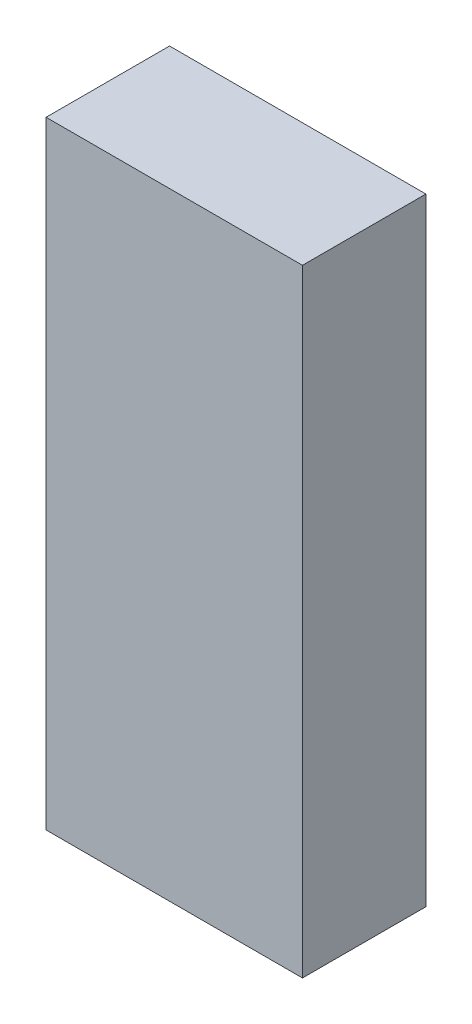
ISO-10303-21;
HEADER;
FILE_DESCRIPTION(('STEP AP214'),'2;1');
FILE_NAME('part.step','',(''),(''),'','','');
FILE_SCHEMA(('AUTOMOTIVE_DESIGN { 1 0 10303 214 1 1 1 1 }'));
ENDSEC;
DATA;
#1=APPLICATION_CONTEXT('core data for automotive mechanical design processes');
#2=APPLICATION_PROTOCOL_DEFINITION('international standard','automotive_design',2000,#1);
#3=PRODUCT_CONTEXT('',#1,'mechanical');
#4=PRODUCT('Part','Part','',(#3));
#5=PRODUCT_RELATED_PRODUCT_CATEGORY('part','',(#4));
#6=PRODUCT_DEFINITION_FORMATION('','',#4);
#7=PRODUCT_DEFINITION_CONTEXT('part definition',#1,'design');
#8=PRODUCT_DEFINITION('design','',#6,#7);
#9=PRODUCT_DEFINITION_SHAPE('','',#8);
#10=(LENGTH_UNIT() NAMED_UNIT(*) SI_UNIT(.MILLI.,.METRE.));
#11=(NAMED_UNIT(*) PLANE_ANGLE_UNIT() SI_UNIT($,.RADIAN.));
#12=(NAMED_UNIT(*) SI_UNIT($,.STERADIAN.) SOLID_ANGLE_UNIT());
#13=UNCERTAINTY_MEASURE_WITH_UNIT(LENGTH_MEASURE(1.E-05),#10,'distance_accuracy_value','');
#14=(GEOMETRIC_REPRESENTATION_CONTEXT(3) GLOBAL_UNCERTAINTY_ASSIGNED_CONTEXT((#13)) GLOBAL_UNIT_ASSIGNED_CONTEXT((#10,
#11,#12)) REPRESENTATION_CONTEXT('',''));
#15=CARTESIAN_POINT('',(0.,0.,0.));
#16=DIRECTION('',(0.,0.,1.));
#17=DIRECTION('',(1.,0.,0.));
#18=AXIS2_PLACEMENT_3D('',#15,#16,#17);
#19=CARTESIAN_POINT('',(13.5,-32.5,6.5));
#20=DIRECTION('',(-1.,0.,0.));
#21=DIRECTION('',(0.,0.,1.));
#22=AXIS2_PLACEMENT_3D('',#19,#20,#21);
#23=PLANE('',#22);
#24=DIRECTION('',(0.,1.,0.));
#25=VECTOR('',#24,1.);
#26=CARTESIAN_POINT('',(13.5,-32.5,-6.5));
#27=LINE('',#26,#25);
#28=CARTESIAN_POINT('',(13.5,-32.5,-6.5));
#29=VERTEX_POINT('',#28);
#30=CARTESIAN_POINT('',(13.5,32.5,-6.5));
#31=VERTEX_POINT('',#30);
#32=EDGE_CURVE('E104',#29,#31,#27,.T.);
#33=ORIENTED_EDGE('',*,*,#32,.T.);
#34=DIRECTION('',(0.,0.,-1.));
#35=VECTOR('',#34,1.);
#36=CARTESIAN_POINT('',(13.5,32.5,6.5));
#37=LINE('',#36,#35);
#38=CARTESIAN_POINT('',(13.5,32.5,6.5));
#39=VERTEX_POINT('',#38);
#40=EDGE_CURVE('E11',#39,#31,#37,.T.);
#41=ORIENTED_EDGE('',*,*,#40,.F.);
#42=DIRECTION('',(0.,1.,0.));
#43=VECTOR('',#42,1.);
#44=CARTESIAN_POINT('',(13.5,-32.5,6.5));
#45=LINE('',#44,#43);
#46=CARTESIAN_POINT('',(13.5,-32.5,6.5));
#47=VERTEX_POINT('',#46);
#48=EDGE_CURVE('E92',#47,#39,#45,.T.);
#49=ORIENTED_EDGE('',*,*,#48,.F.);
#50=DIRECTION('',(0.,0.,-1.));
#51=VECTOR('',#50,1.);
#52=CARTESIAN_POINT('',(13.5,-32.5,6.5));
#53=LINE('',#52,#51);
#54=EDGE_CURVE('E100',#47,#29,#53,.T.);
#55=ORIENTED_EDGE('',*,*,#54,.T.);
#56=EDGE_LOOP('',(#33,#41,#49,#55));
#57=FACE_BOUND('',#56,.T.);
#58=ADVANCED_FACE('F41',(#57),#23,.F.);
#59=CARTESIAN_POINT('',(-13.5,32.5,6.5));
#60=DIRECTION('',(0.,-1.,0.));
#61=DIRECTION('',(0.,0.,-1.));
#62=AXIS2_PLACEMENT_3D('',#59,#60,#61);
#63=PLANE('',#62);
#64=DIRECTION('',(-1.,0.,0.));
#65=VECTOR('',#64,1.);
#66=CARTESIAN_POINT('',(-13.5,32.5,-6.5));
#67=LINE('',#66,#65);
#68=CARTESIAN_POINT('',(-13.5,32.5,-6.5));
#69=VERTEX_POINT('',#68);
#70=EDGE_CURVE('E96',#31,#69,#67,.T.);
#71=ORIENTED_EDGE('',*,*,#70,.T.);
#72=DIRECTION('',(0.,0.,-1.));
#73=VECTOR('',#72,1.);
#74=CARTESIAN_POINT('',(-13.5,32.5,6.5));
#75=LINE('',#74,#73);
#76=CARTESIAN_POINT('',(-13.5,32.5,6.5));
#77=VERTEX_POINT('',#76);
#78=EDGE_CURVE('E49',#77,#69,#75,.T.);
#79=ORIENTED_EDGE('',*,*,#78,.F.);
#80=DIRECTION('',(-1.,0.,0.));
#81=VECTOR('',#80,1.);
#82=CARTESIAN_POINT('',(-13.5,32.5,6.5));
#83=LINE('',#82,#81);
#84=EDGE_CURVE('E87',#39,#77,#83,.T.);
#85=ORIENTED_EDGE('',*,*,#84,.F.);
#86=ORIENTED_EDGE('',*,*,#40,.T.);
#87=EDGE_LOOP('',(#71,#79,#85,#86));
#88=FACE_BOUND('',#87,.T.);
#89=ADVANCED_FACE('F95',(#88),#63,.F.);
#90=CARTESIAN_POINT('',(-13.5,-32.5,6.5));
#91=DIRECTION('',(1.,0.,0.));
#92=DIRECTION('',(0.,0.,-1.));
#93=AXIS2_PLACEMENT_3D('',#90,#91,#92);
#94=PLANE('',#93);
#95=DIRECTION('',(0.,-1.,0.));
#96=VECTOR('',#95,1.);
#97=CARTESIAN_POINT('',(-13.5,-32.5,-6.5));
#98=LINE('',#97,#96);
#99=CARTESIAN_POINT('',(-13.5,-32.5,-6.5));
#100=VERTEX_POINT('',#99);
#101=EDGE_CURVE('E74',#69,#100,#98,.T.);
#102=ORIENTED_EDGE('',*,*,#101,.T.);
#103=DIRECTION('',(0.,0.,-1.));
#104=VECTOR('',#103,1.);
#105=CARTESIAN_POINT('',(-13.5,-32.5,6.5));
#106=LINE('',#105,#104);
#107=CARTESIAN_POINT('',(-13.5,-32.5,6.5));
#108=VERTEX_POINT('',#107);
#109=EDGE_CURVE('E97',#108,#100,#106,.T.);
#110=ORIENTED_EDGE('',*,*,#109,.F.);
#111=DIRECTION('',(0.,-1.,0.));
#112=VECTOR('',#111,1.);
#113=CARTESIAN_POINT('',(-13.5,-32.5,6.5));
#114=LINE('',#113,#112);
#115=EDGE_CURVE('E90',#77,#108,#114,.T.);
#116=ORIENTED_EDGE('',*,*,#115,.F.);
#117=ORIENTED_EDGE('',*,*,#78,.T.);
#118=EDGE_LOOP('',(#102,#110,#116,#117));
#119=FACE_BOUND('',#118,.T.);
#120=ADVANCED_FACE('F98',(#119),#94,.F.);
#121=CARTESIAN_POINT('',(-13.5,-32.5,6.5));
#122=DIRECTION('',(0.,1.,0.));
#123=DIRECTION('',(0.,0.,1.));
#124=AXIS2_PLACEMENT_3D('',#121,#122,#123);
#125=PLANE('',#124);
#126=DIRECTION('',(1.,0.,0.));
#127=VECTOR('',#126,1.);
#128=CARTESIAN_POINT('',(-13.5,-32.5,-6.5));
#129=LINE('',#128,#127);
#130=EDGE_CURVE('E80',#100,#29,#129,.T.);
#131=ORIENTED_EDGE('',*,*,#130,.T.);
#132=ORIENTED_EDGE('',*,*,#54,.F.);
#133=DIRECTION('',(1.,0.,0.));
#134=VECTOR('',#133,1.);
#135=CARTESIAN_POINT('',(-13.5,-32.5,6.5));
#136=LINE('',#135,#134);
#137=EDGE_CURVE('E57',#108,#47,#136,.T.);
#138=ORIENTED_EDGE('',*,*,#137,.F.);
#139=ORIENTED_EDGE('',*,*,#109,.T.);
#140=EDGE_LOOP('',(#131,#132,#138,#139));
#141=FACE_BOUND('',#140,.T.);
#142=ADVANCED_FACE('F111',(#141),#125,.F.);
#143=CARTESIAN_POINT('',(0.,0.,6.5));
#144=DIRECTION('',(0.,0.,-1.));
#145=DIRECTION('',(-1.,0.,0.));
#146=AXIS2_PLACEMENT_3D('',#143,#144,#145);
#147=PLANE('',#146);
#148=ORIENTED_EDGE('',*,*,#48,.T.);
#149=ORIENTED_EDGE('',*,*,#84,.T.);
#150=ORIENTED_EDGE('',*,*,#115,.T.);
#151=ORIENTED_EDGE('',*,*,#137,.T.);
#152=EDGE_LOOP('',(#148,#149,#150,#151));
#153=FACE_BOUND('',#152,.T.);
#154=ADVANCED_FACE('F88',(#153),#147,.F.);
#155=CARTESIAN_POINT('',(0.,0.,-6.5));
#156=DIRECTION('',(0.,0.,-1.));
#157=DIRECTION('',(-1.,0.,0.));
#158=AXIS2_PLACEMENT_3D('',#155,#156,#157);
#159=PLANE('',#158);
#160=ORIENTED_EDGE('',*,*,#32,.F.);
#161=ORIENTED_EDGE('',*,*,#130,.F.);
#162=ORIENTED_EDGE('',*,*,#101,.F.);
#163=ORIENTED_EDGE('',*,*,#70,.F.);
#164=EDGE_LOOP('',(#160,#161,#162,#163));
#165=FACE_BOUND('',#164,.T.);
#166=ADVANCED_FACE('F114',(#165),#159,.T.);
#167=CLOSED_SHELL('',(#58,#89,#120,#142,#154,#166));
#168=MANIFOLD_SOLID_BREP('B2',#167);
#169=ADVANCED_BREP_SHAPE_REPRESENTATION('',(#18,#168),#14);
#170=SHAPE_DEFINITION_REPRESENTATION(#9,#169);
ENDSEC;
END-ISO-10303-21;
